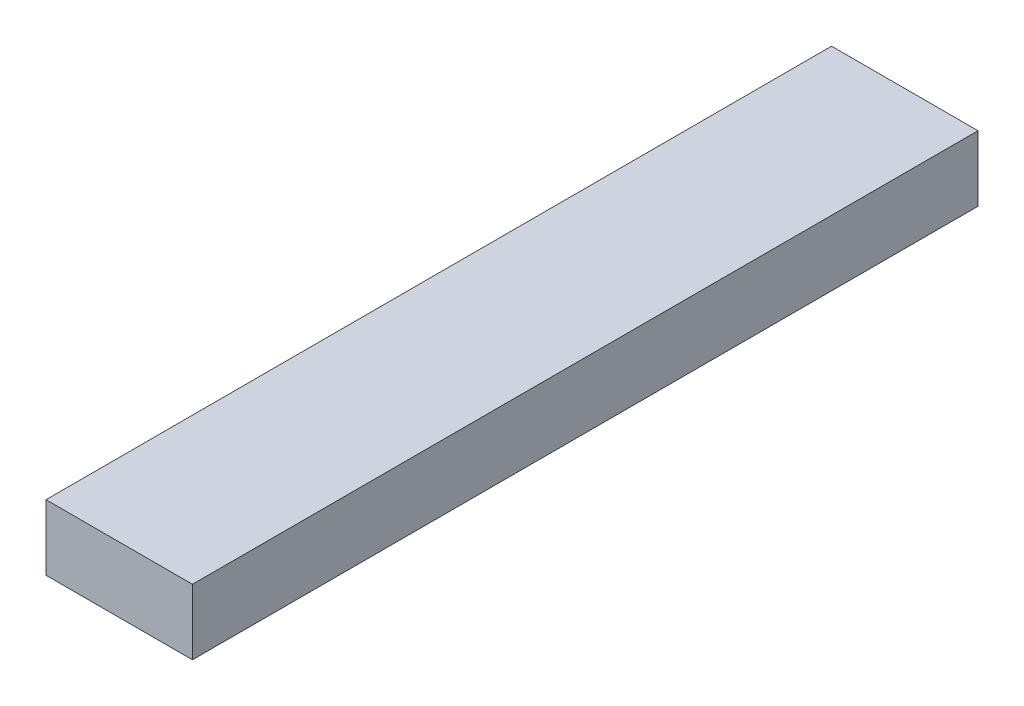
ISO-10303-21;
HEADER;
FILE_DESCRIPTION(('STEP AP214'),'2;1');
FILE_NAME('part.step','',(''),(''),'','','');
FILE_SCHEMA(('AUTOMOTIVE_DESIGN { 1 0 10303 214 1 1 1 1 }'));
ENDSEC;
DATA;
#1=APPLICATION_CONTEXT('core data for automotive mechanical design processes');
#2=APPLICATION_PROTOCOL_DEFINITION('international standard','automotive_design',2000,#1);
#3=PRODUCT_CONTEXT('',#1,'mechanical');
#4=PRODUCT('Part','Part','',(#3));
#5=PRODUCT_RELATED_PRODUCT_CATEGORY('part','',(#4));
#6=PRODUCT_DEFINITION_FORMATION('','',#4);
#7=PRODUCT_DEFINITION_CONTEXT('part definition',#1,'design');
#8=PRODUCT_DEFINITION('design','',#6,#7);
#9=PRODUCT_DEFINITION_SHAPE('','',#8);
#10=(LENGTH_UNIT() NAMED_UNIT(*) SI_UNIT(.MILLI.,.METRE.));
#11=(NAMED_UNIT(*) PLANE_ANGLE_UNIT() SI_UNIT($,.RADIAN.));
#12=(NAMED_UNIT(*) SI_UNIT($,.STERADIAN.) SOLID_ANGLE_UNIT());
#13=UNCERTAINTY_MEASURE_WITH_UNIT(LENGTH_MEASURE(1.E-05),#10,'distance_accuracy_value','');
#14=(GEOMETRIC_REPRESENTATION_CONTEXT(3) GLOBAL_UNCERTAINTY_ASSIGNED_CONTEXT((#13)) GLOBAL_UNIT_ASSIGNED_CONTEXT((#10,
#11,#12)) REPRESENTATION_CONTEXT('',''));
#15=CARTESIAN_POINT('',(0.,0.,0.));
#16=DIRECTION('',(0.,0.,1.));
#17=DIRECTION('',(1.,0.,0.));
#18=AXIS2_PLACEMENT_3D('',#15,#16,#17);
#19=CARTESIAN_POINT('',(18.6436,8.3312,100.));
#20=DIRECTION('',(0.,-1.,0.));
#21=DIRECTION('',(0.,0.,-1.));
#22=AXIS2_PLACEMENT_3D('',#19,#20,#21);
#23=PLANE('',#22);
#24=DIRECTION('',(-1.,0.,0.));
#25=VECTOR('',#24,1.);
#26=CARTESIAN_POINT('',(18.6436,8.3312,-100.));
#27=LINE('',#26,#25);
#28=CARTESIAN_POINT('',(18.6436,8.3312,-100.));
#29=VERTEX_POINT('',#28);
#30=CARTESIAN_POINT('',(-18.6436,8.3312,-100.));
#31=VERTEX_POINT('',#30);
#32=EDGE_CURVE('E104',#29,#31,#27,.T.);
#33=ORIENTED_EDGE('',*,*,#32,.T.);
#34=DIRECTION('',(0.,0.,-1.));
#35=VECTOR('',#34,1.);
#36=CARTESIAN_POINT('',(-18.6436,8.3312,100.));
#37=LINE('',#36,#35);
#38=CARTESIAN_POINT('',(-18.6436,8.3312,100.));
#39=VERTEX_POINT('',#38);
#40=EDGE_CURVE('E11',#39,#31,#37,.T.);
#41=ORIENTED_EDGE('',*,*,#40,.F.);
#42=DIRECTION('',(-1.,0.,0.));
#43=VECTOR('',#42,1.);
#44=CARTESIAN_POINT('',(18.6436,8.3312,100.));
#45=LINE('',#44,#43);
#46=CARTESIAN_POINT('',(18.6436,8.3312,100.));
#47=VERTEX_POINT('',#46);
#48=EDGE_CURVE('E92',#47,#39,#45,.T.);
#49=ORIENTED_EDGE('',*,*,#48,.F.);
#50=DIRECTION('',(0.,0.,-1.));
#51=VECTOR('',#50,1.);
#52=CARTESIAN_POINT('',(18.6436,8.3312,100.));
#53=LINE('',#52,#51);
#54=EDGE_CURVE('E100',#47,#29,#53,.T.);
#55=ORIENTED_EDGE('',*,*,#54,.T.);
#56=EDGE_LOOP('',(#33,#41,#49,#55));
#57=FACE_BOUND('',#56,.T.);
#58=ADVANCED_FACE('F41',(#57),#23,.F.);
#59=CARTESIAN_POINT('',(-18.6436,-8.3312,100.));
#60=DIRECTION('',(1.,0.,0.));
#61=DIRECTION('',(0.,0.,-1.));
#62=AXIS2_PLACEMENT_3D('',#59,#60,#61);
#63=PLANE('',#62);
#64=DIRECTION('',(0.,-1.,0.));
#65=VECTOR('',#64,1.);
#66=CARTESIAN_POINT('',(-18.6436,-8.3312,-100.));
#67=LINE('',#66,#65);
#68=CARTESIAN_POINT('',(-18.6436,-8.3312,-100.));
#69=VERTEX_POINT('',#68);
#70=EDGE_CURVE('E96',#31,#69,#67,.T.);
#71=ORIENTED_EDGE('',*,*,#70,.T.);
#72=DIRECTION('',(0.,0.,-1.));
#73=VECTOR('',#72,1.);
#74=CARTESIAN_POINT('',(-18.6436,-8.3312,100.));
#75=LINE('',#74,#73);
#76=CARTESIAN_POINT('',(-18.6436,-8.3312,100.));
#77=VERTEX_POINT('',#76);
#78=EDGE_CURVE('E49',#77,#69,#75,.T.);
#79=ORIENTED_EDGE('',*,*,#78,.F.);
#80=DIRECTION('',(0.,-1.,0.));
#81=VECTOR('',#80,1.);
#82=CARTESIAN_POINT('',(-18.6436,-8.3312,100.));
#83=LINE('',#82,#81);
#84=EDGE_CURVE('E87',#39,#77,#83,.T.);
#85=ORIENTED_EDGE('',*,*,#84,.F.);
#86=ORIENTED_EDGE('',*,*,#40,.T.);
#87=EDGE_LOOP('',(#71,#79,#85,#86));
#88=FACE_BOUND('',#87,.T.);
#89=ADVANCED_FACE('F95',(#88),#63,.F.);
#90=CARTESIAN_POINT('',(18.6436,-8.3312,100.));
#91=DIRECTION('',(0.,1.,0.));
#92=DIRECTION('',(0.,0.,1.));
#93=AXIS2_PLACEMENT_3D('',#90,#91,#92);
#94=PLANE('',#93);
#95=DIRECTION('',(1.,0.,0.));
#96=VECTOR('',#95,1.);
#97=CARTESIAN_POINT('',(18.6436,-8.3312,-100.));
#98=LINE('',#97,#96);
#99=CARTESIAN_POINT('',(18.6436,-8.3312,-100.));
#100=VERTEX_POINT('',#99);
#101=EDGE_CURVE('E74',#69,#100,#98,.T.);
#102=ORIENTED_EDGE('',*,*,#101,.T.);
#103=DIRECTION('',(0.,0.,-1.));
#104=VECTOR('',#103,1.);
#105=CARTESIAN_POINT('',(18.6436,-8.3312,100.));
#106=LINE('',#105,#104);
#107=CARTESIAN_POINT('',(18.6436,-8.3312,100.));
#108=VERTEX_POINT('',#107);
#109=EDGE_CURVE('E97',#108,#100,#106,.T.);
#110=ORIENTED_EDGE('',*,*,#109,.F.);
#111=DIRECTION('',(1.,0.,0.));
#112=VECTOR('',#111,1.);
#113=CARTESIAN_POINT('',(18.6436,-8.3312,100.));
#114=LINE('',#113,#112);
#115=EDGE_CURVE('E90',#77,#108,#114,.T.);
#116=ORIENTED_EDGE('',*,*,#115,.F.);
#117=ORIENTED_EDGE('',*,*,#78,.T.);
#118=EDGE_LOOP('',(#102,#110,#116,#117));
#119=FACE_BOUND('',#118,.T.);
#120=ADVANCED_FACE('F98',(#119),#94,.F.);
#121=CARTESIAN_POINT('',(18.6436,-8.3312,100.));
#122=DIRECTION('',(-1.,0.,0.));
#123=DIRECTION('',(0.,0.,1.));
#124=AXIS2_PLACEMENT_3D('',#121,#122,#123);
#125=PLANE('',#124);
#126=DIRECTION('',(0.,1.,0.));
#127=VECTOR('',#126,1.);
#128=CARTESIAN_POINT('',(18.6436,-8.3312,-100.));
#129=LINE('',#128,#127);
#130=EDGE_CURVE('E80',#100,#29,#129,.T.);
#131=ORIENTED_EDGE('',*,*,#130,.T.);
#132=ORIENTED_EDGE('',*,*,#54,.F.);
#133=DIRECTION('',(0.,1.,0.));
#134=VECTOR('',#133,1.);
#135=CARTESIAN_POINT('',(18.6436,-8.3312,100.));
#136=LINE('',#135,#134);
#137=EDGE_CURVE('E57',#108,#47,#136,.T.);
#138=ORIENTED_EDGE('',*,*,#137,.F.);
#139=ORIENTED_EDGE('',*,*,#109,.T.);
#140=EDGE_LOOP('',(#131,#132,#138,#139));
#141=FACE_BOUND('',#140,.T.);
#142=ADVANCED_FACE('F111',(#141),#125,.F.);
#143=CARTESIAN_POINT('',(0.,0.,100.));
#144=DIRECTION('',(0.,0.,-1.));
#145=DIRECTION('',(-1.,0.,0.));
#146=AXIS2_PLACEMENT_3D('',#143,#144,#145);
#147=PLANE('',#146);
#148=ORIENTED_EDGE('',*,*,#48,.T.);
#149=ORIENTED_EDGE('',*,*,#84,.T.);
#150=ORIENTED_EDGE('',*,*,#115,.T.);
#151=ORIENTED_EDGE('',*,*,#137,.T.);
#152=EDGE_LOOP('',(#148,#149,#150,#151));
#153=FACE_BOUND('',#152,.T.);
#154=ADVANCED_FACE('F88',(#153),#147,.F.);
#155=CARTESIAN_POINT('',(0.,0.,-100.));
#156=DIRECTION('',(0.,0.,-1.));
#157=DIRECTION('',(-1.,0.,0.));
#158=AXIS2_PLACEMENT_3D('',#155,#156,#157);
#159=PLANE('',#158);
#160=ORIENTED_EDGE('',*,*,#32,.F.);
#161=ORIENTED_EDGE('',*,*,#130,.F.);
#162=ORIENTED_EDGE('',*,*,#101,.F.);
#163=ORIENTED_EDGE('',*,*,#70,.F.);
#164=EDGE_LOOP('',(#160,#161,#162,#163));
#165=FACE_BOUND('',#164,.T.);
#166=ADVANCED_FACE('F114',(#165),#159,.T.);
#167=CLOSED_SHELL('',(#58,#89,#120,#142,#154,#166));
#168=MANIFOLD_SOLID_BREP('B2',#167);
#169=ADVANCED_BREP_SHAPE_REPRESENTATION('',(#18,#168),#14);
#170=SHAPE_DEFINITION_REPRESENTATION(#9,#169);
ENDSEC;
END-ISO-10303-21;
